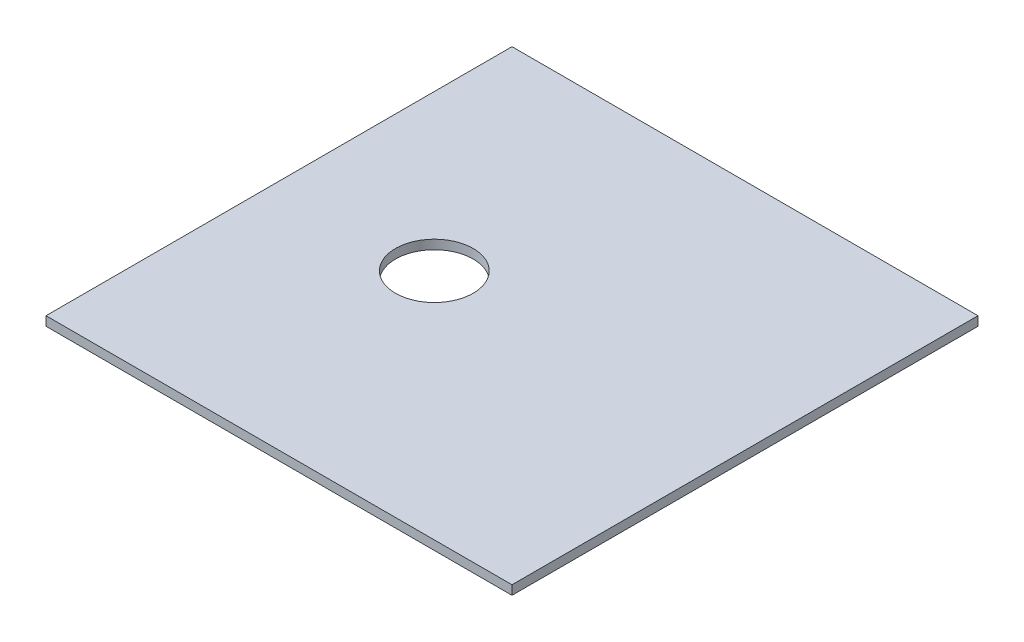
ISO-10303-21;
HEADER;
FILE_DESCRIPTION(('STEP AP214'),'2;1');
FILE_NAME('part.step','',(''),(''),'','','');
FILE_SCHEMA(('AUTOMOTIVE_DESIGN { 1 0 10303 214 1 1 1 1 }'));
ENDSEC;
DATA;
#1=APPLICATION_CONTEXT('core data for automotive mechanical design processes');
#2=APPLICATION_PROTOCOL_DEFINITION('international standard','automotive_design',2000,#1);
#3=PRODUCT_CONTEXT('',#1,'mechanical');
#4=PRODUCT('Part','Part','',(#3));
#5=PRODUCT_RELATED_PRODUCT_CATEGORY('part','',(#4));
#6=PRODUCT_DEFINITION_FORMATION('','',#4);
#7=PRODUCT_DEFINITION_CONTEXT('part definition',#1,'design');
#8=PRODUCT_DEFINITION('design','',#6,#7);
#9=PRODUCT_DEFINITION_SHAPE('','',#8);
#10=(LENGTH_UNIT() NAMED_UNIT(*) SI_UNIT(.MILLI.,.METRE.));
#11=(NAMED_UNIT(*) PLANE_ANGLE_UNIT() SI_UNIT($,.RADIAN.));
#12=(NAMED_UNIT(*) SI_UNIT($,.STERADIAN.) SOLID_ANGLE_UNIT());
#13=UNCERTAINTY_MEASURE_WITH_UNIT(LENGTH_MEASURE(1.E-05),#10,'distance_accuracy_value','');
#14=(GEOMETRIC_REPRESENTATION_CONTEXT(3) GLOBAL_UNCERTAINTY_ASSIGNED_CONTEXT((#13)) GLOBAL_UNIT_ASSIGNED_CONTEXT((#10,
#11,#12)) REPRESENTATION_CONTEXT('',''));
#15=CARTESIAN_POINT('',(0.,0.,0.));
#16=DIRECTION('',(0.,0.,1.));
#17=DIRECTION('',(1.,0.,0.));
#18=AXIS2_PLACEMENT_3D('',#15,#16,#17);
#19=CARTESIAN_POINT('',(76.2,-3.,0.));
#20=DIRECTION('',(-1.,0.,0.));
#21=DIRECTION('',(0.,0.,1.));
#22=AXIS2_PLACEMENT_3D('',#19,#20,#21);
#23=PLANE('',#22);
#24=DIRECTION('',(0.,0.,1.));
#25=VECTOR('',#24,1.);
#26=CARTESIAN_POINT('',(76.2,0.,0.));
#27=LINE('',#26,#25);
#28=CARTESIAN_POINT('',(76.2,0.,-76.2));
#29=VERTEX_POINT('',#28);
#30=CARTESIAN_POINT('',(76.2,0.,76.2));
#31=VERTEX_POINT('',#30);
#32=EDGE_CURVE('E109',#29,#31,#27,.T.);
#33=ORIENTED_EDGE('',*,*,#32,.T.);
#34=DIRECTION('',(0.,1.,0.));
#35=VECTOR('',#34,1.);
#36=CARTESIAN_POINT('',(76.2,-3.,76.2));
#37=LINE('',#36,#35);
#38=CARTESIAN_POINT('',(76.2,-3.,76.2));
#39=VERTEX_POINT('',#38);
#40=EDGE_CURVE('E11',#39,#31,#37,.T.);
#41=ORIENTED_EDGE('',*,*,#40,.F.);
#42=DIRECTION('',(0.,0.,1.));
#43=VECTOR('',#42,1.);
#44=CARTESIAN_POINT('',(76.2,-3.,0.));
#45=LINE('',#44,#43);
#46=CARTESIAN_POINT('',(76.2,-3.,-76.2));
#47=VERTEX_POINT('',#46);
#48=EDGE_CURVE('E62',#47,#39,#45,.T.);
#49=ORIENTED_EDGE('',*,*,#48,.F.);
#50=DIRECTION('',(0.,1.,0.));
#51=VECTOR('',#50,1.);
#52=CARTESIAN_POINT('',(76.2,-3.,-76.2));
#53=LINE('',#52,#51);
#54=EDGE_CURVE('E47',#47,#29,#53,.T.);
#55=ORIENTED_EDGE('',*,*,#54,.T.);
#56=EDGE_LOOP('',(#33,#41,#49,#55));
#57=FACE_BOUND('',#56,.T.);
#58=ADVANCED_FACE('F43',(#57),#23,.F.);
#59=CARTESIAN_POINT('',(0.,-3.,76.2));
#60=DIRECTION('',(0.,0.,1.));
#61=DIRECTION('',(1.,0.,0.));
#62=AXIS2_PLACEMENT_3D('',#59,#60,#61);
#63=PLANE('',#62);
#64=DIRECTION('',(1.,0.,0.));
#65=VECTOR('',#64,1.);
#66=CARTESIAN_POINT('',(0.,0.,76.2));
#67=LINE('',#66,#65);
#68=CARTESIAN_POINT('',(-76.2,0.,76.2));
#69=VERTEX_POINT('',#68);
#70=EDGE_CURVE('E114',#69,#31,#67,.T.);
#71=ORIENTED_EDGE('',*,*,#70,.F.);
#72=DIRECTION('',(0.,1.,0.));
#73=VECTOR('',#72,1.);
#74=CARTESIAN_POINT('',(-76.2,-3.,76.2));
#75=LINE('',#74,#73);
#76=CARTESIAN_POINT('',(-76.2,-3.,76.2));
#77=VERTEX_POINT('',#76);
#78=EDGE_CURVE('E53',#77,#69,#75,.T.);
#79=ORIENTED_EDGE('',*,*,#78,.F.);
#80=DIRECTION('',(1.,0.,0.));
#81=VECTOR('',#80,1.);
#82=CARTESIAN_POINT('',(0.,-3.,76.2));
#83=LINE('',#82,#81);
#84=EDGE_CURVE('E101',#77,#39,#83,.T.);
#85=ORIENTED_EDGE('',*,*,#84,.T.);
#86=ORIENTED_EDGE('',*,*,#40,.T.);
#87=EDGE_LOOP('',(#71,#79,#85,#86));
#88=FACE_BOUND('',#87,.T.);
#89=ADVANCED_FACE('F133',(#88),#63,.T.);
#90=CARTESIAN_POINT('',(-76.2,-3.,0.));
#91=DIRECTION('',(-1.,0.,0.));
#92=DIRECTION('',(0.,0.,1.));
#93=AXIS2_PLACEMENT_3D('',#90,#91,#92);
#94=PLANE('',#93);
#95=DIRECTION('',(0.,0.,1.));
#96=VECTOR('',#95,1.);
#97=CARTESIAN_POINT('',(-76.2,0.,0.));
#98=LINE('',#97,#96);
#99=CARTESIAN_POINT('',(-76.2,0.,-76.2));
#100=VERTEX_POINT('',#99);
#101=EDGE_CURVE('E94',#100,#69,#98,.T.);
#102=ORIENTED_EDGE('',*,*,#101,.F.);
#103=DIRECTION('',(0.,1.,0.));
#104=VECTOR('',#103,1.);
#105=CARTESIAN_POINT('',(-76.2,-3.,-76.2));
#106=LINE('',#105,#104);
#107=CARTESIAN_POINT('',(-76.2,-3.,-76.2));
#108=VERTEX_POINT('',#107);
#109=EDGE_CURVE('E91',#108,#100,#106,.T.);
#110=ORIENTED_EDGE('',*,*,#109,.F.);
#111=DIRECTION('',(0.,0.,1.));
#112=VECTOR('',#111,1.);
#113=CARTESIAN_POINT('',(-76.2,-3.,0.));
#114=LINE('',#113,#112);
#115=EDGE_CURVE('E93',#108,#77,#114,.T.);
#116=ORIENTED_EDGE('',*,*,#115,.T.);
#117=ORIENTED_EDGE('',*,*,#78,.T.);
#118=EDGE_LOOP('',(#102,#110,#116,#117));
#119=FACE_BOUND('',#118,.T.);
#120=ADVANCED_FACE('F92',(#119),#94,.T.);
#121=CARTESIAN_POINT('',(-25.4,-3.,0.));
#122=DIRECTION('',(0.,1.,0.));
#123=DIRECTION('',(0.,0.,1.));
#124=AXIS2_PLACEMENT_3D('',#121,#122,#123);
#125=CYLINDRICAL_SURFACE('',#124,12.7);
#126=CARTESIAN_POINT('',(-25.4,-3.,0.));
#127=DIRECTION('',(0.,1.,0.));
#128=DIRECTION('',(0.,0.,1.));
#129=AXIS2_PLACEMENT_3D('',#126,#127,#128);
#130=CIRCLE('',#129,12.7);
#131=CARTESIAN_POINT('',(-25.4,-3.,12.7));
#132=VERTEX_POINT('',#131);
#133=EDGE_CURVE('E116',#132,#132,#130,.T.);
#134=ORIENTED_EDGE('',*,*,#133,.F.);
#135=EDGE_LOOP('',(#134));
#136=FACE_BOUND('',#135,.T.);
#137=CARTESIAN_POINT('',(-25.4,0.,0.));
#138=DIRECTION('',(0.,1.,0.));
#139=DIRECTION('',(0.,0.,1.));
#140=AXIS2_PLACEMENT_3D('',#137,#138,#139);
#141=CIRCLE('',#140,12.7);
#142=CARTESIAN_POINT('',(-25.4,0.,12.7));
#143=VERTEX_POINT('',#142);
#144=EDGE_CURVE('E106',#143,#143,#141,.T.);
#145=ORIENTED_EDGE('',*,*,#144,.T.);
#146=EDGE_LOOP('',(#145));
#147=FACE_BOUND('',#146,.T.);
#148=ADVANCED_FACE('F45',(#136,#147),#125,.F.);
#149=CARTESIAN_POINT('',(0.,-3.,-76.2));
#150=DIRECTION('',(0.,0.,1.));
#151=DIRECTION('',(1.,0.,0.));
#152=AXIS2_PLACEMENT_3D('',#149,#150,#151);
#153=PLANE('',#152);
#154=DIRECTION('',(1.,0.,0.));
#155=VECTOR('',#154,1.);
#156=CARTESIAN_POINT('',(0.,0.,-76.2));
#157=LINE('',#156,#155);
#158=EDGE_CURVE('E111',#100,#29,#157,.T.);
#159=ORIENTED_EDGE('',*,*,#158,.T.);
#160=ORIENTED_EDGE('',*,*,#54,.F.);
#161=DIRECTION('',(1.,0.,0.));
#162=VECTOR('',#161,1.);
#163=CARTESIAN_POINT('',(0.,-3.,-76.2));
#164=LINE('',#163,#162);
#165=EDGE_CURVE('E88',#108,#47,#164,.T.);
#166=ORIENTED_EDGE('',*,*,#165,.F.);
#167=ORIENTED_EDGE('',*,*,#109,.T.);
#168=EDGE_LOOP('',(#159,#160,#166,#167));
#169=FACE_BOUND('',#168,.T.);
#170=ADVANCED_FACE('F97',(#169),#153,.F.);
#171=CARTESIAN_POINT('',(0.,-3.,0.));
#172=DIRECTION('',(0.,1.,0.));
#173=DIRECTION('',(0.,0.,1.));
#174=AXIS2_PLACEMENT_3D('',#171,#172,#173);
#175=PLANE('',#174);
#176=ORIENTED_EDGE('',*,*,#133,.T.);
#177=EDGE_LOOP('',(#176));
#178=FACE_BOUND('',#177,.T.);
#179=ORIENTED_EDGE('',*,*,#48,.T.);
#180=ORIENTED_EDGE('',*,*,#84,.F.);
#181=ORIENTED_EDGE('',*,*,#115,.F.);
#182=ORIENTED_EDGE('',*,*,#165,.T.);
#183=EDGE_LOOP('',(#179,#180,#181,#182));
#184=FACE_BOUND('',#183,.T.);
#185=ADVANCED_FACE('F100',(#178,#184),#175,.F.);
#186=CARTESIAN_POINT('',(0.,0.,0.));
#187=DIRECTION('',(0.,1.,0.));
#188=DIRECTION('',(0.,0.,1.));
#189=AXIS2_PLACEMENT_3D('',#186,#187,#188);
#190=PLANE('',#189);
#191=ORIENTED_EDGE('',*,*,#144,.F.);
#192=EDGE_LOOP('',(#191));
#193=FACE_BOUND('',#192,.T.);
#194=ORIENTED_EDGE('',*,*,#32,.F.);
#195=ORIENTED_EDGE('',*,*,#158,.F.);
#196=ORIENTED_EDGE('',*,*,#101,.T.);
#197=ORIENTED_EDGE('',*,*,#70,.T.);
#198=EDGE_LOOP('',(#194,#195,#196,#197));
#199=FACE_BOUND('',#198,.T.);
#200=ADVANCED_FACE('F129',(#193,#199),#190,.T.);
#201=CLOSED_SHELL('',(#58,#89,#120,#148,#170,#185,#200));
#202=MANIFOLD_SOLID_BREP('B2',#201);
#203=ADVANCED_BREP_SHAPE_REPRESENTATION('',(#18,#202),#14);
#204=SHAPE_DEFINITION_REPRESENTATION(#9,#203);
ENDSEC;
END-ISO-10303-21;
